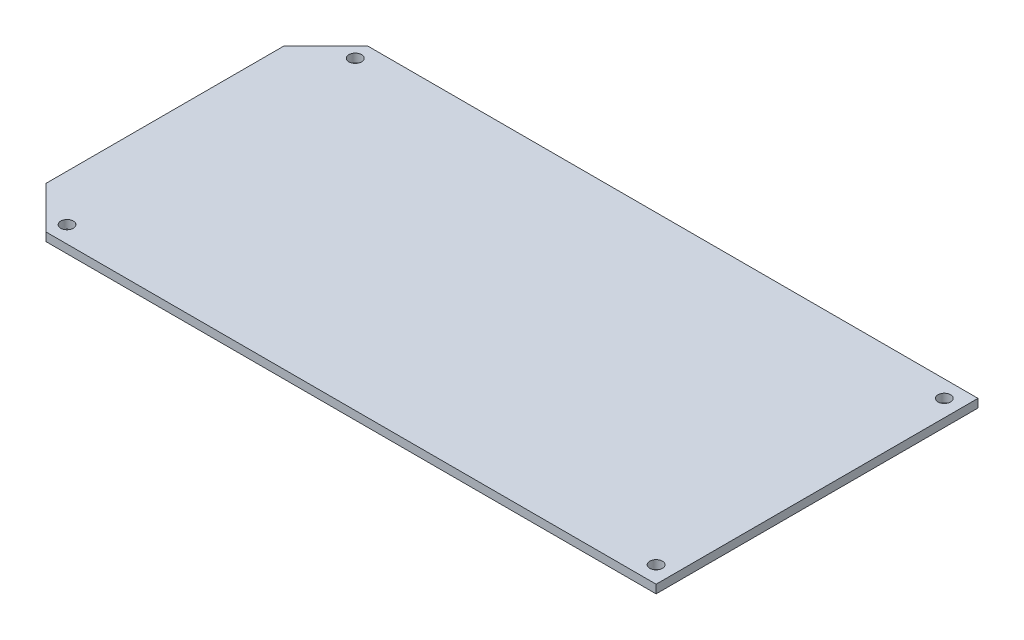
ISO-10303-21;
HEADER;
FILE_DESCRIPTION(('STEP AP214'),'2;1');
FILE_NAME('part.step','',(''),(''),'','','');
FILE_SCHEMA(('AUTOMOTIVE_DESIGN { 1 0 10303 214 1 1 1 1 }'));
ENDSEC;
DATA;
#1=APPLICATION_CONTEXT('core data for automotive mechanical design processes');
#2=APPLICATION_PROTOCOL_DEFINITION('international standard','automotive_design',2000,#1);
#3=PRODUCT_CONTEXT('',#1,'mechanical');
#4=PRODUCT('Part','Part','',(#3));
#5=PRODUCT_RELATED_PRODUCT_CATEGORY('part','',(#4));
#6=PRODUCT_DEFINITION_FORMATION('','',#4);
#7=PRODUCT_DEFINITION_CONTEXT('part definition',#1,'design');
#8=PRODUCT_DEFINITION('design','',#6,#7);
#9=PRODUCT_DEFINITION_SHAPE('','',#8);
#10=(LENGTH_UNIT() NAMED_UNIT(*) SI_UNIT(.MILLI.,.METRE.));
#11=(NAMED_UNIT(*) PLANE_ANGLE_UNIT() SI_UNIT($,.RADIAN.));
#12=(NAMED_UNIT(*) SI_UNIT($,.STERADIAN.) SOLID_ANGLE_UNIT());
#13=UNCERTAINTY_MEASURE_WITH_UNIT(LENGTH_MEASURE(1.E-05),#10,'distance_accuracy_value','');
#14=(GEOMETRIC_REPRESENTATION_CONTEXT(3) GLOBAL_UNCERTAINTY_ASSIGNED_CONTEXT((#13)) GLOBAL_UNIT_ASSIGNED_CONTEXT((#10,
#11,#12)) REPRESENTATION_CONTEXT('',''));
#15=CARTESIAN_POINT('',(0.,0.,0.));
#16=DIRECTION('',(0.,0.,1.));
#17=DIRECTION('',(1.,0.,0.));
#18=AXIS2_PLACEMENT_3D('',#15,#16,#17);
#19=CARTESIAN_POINT('',(77.5,2.,38.25));
#20=DIRECTION('',(-1.,0.,0.));
#21=DIRECTION('',(0.,0.,1.));
#22=AXIS2_PLACEMENT_3D('',#19,#20,#21);
#23=PLANE('',#22);
#24=DIRECTION('',(0.,0.,-1.));
#25=VECTOR('',#24,1.);
#26=CARTESIAN_POINT('',(77.5,0.,38.25));
#27=LINE('',#26,#25);
#28=CARTESIAN_POINT('',(77.5,0.,38.25));
#29=VERTEX_POINT('',#28);
#30=CARTESIAN_POINT('',(77.5,0.,-38.25));
#31=VERTEX_POINT('',#30);
#32=EDGE_CURVE('E109',#29,#31,#27,.T.);
#33=ORIENTED_EDGE('',*,*,#32,.T.);
#34=DIRECTION('',(0.,-1.,0.));
#35=VECTOR('',#34,1.);
#36=CARTESIAN_POINT('',(77.5,2.,-38.25));
#37=LINE('',#36,#35);
#38=CARTESIAN_POINT('',(77.5,2.,-38.25));
#39=VERTEX_POINT('',#38);
#40=EDGE_CURVE('E92',#39,#31,#37,.T.);
#41=ORIENTED_EDGE('',*,*,#40,.F.);
#42=DIRECTION('',(0.,0.,-1.));
#43=VECTOR('',#42,1.);
#44=CARTESIAN_POINT('',(77.5,2.,38.25));
#45=LINE('',#44,#43);
#46=CARTESIAN_POINT('',(77.5,2.,38.25));
#47=VERTEX_POINT('',#46);
#48=EDGE_CURVE('E97',#47,#39,#45,.T.);
#49=ORIENTED_EDGE('',*,*,#48,.F.);
#50=DIRECTION('',(0.,-1.,0.));
#51=VECTOR('',#50,1.);
#52=CARTESIAN_POINT('',(77.5,2.,38.25));
#53=LINE('',#52,#51);
#54=EDGE_CURVE('E111',#47,#29,#53,.T.);
#55=ORIENTED_EDGE('',*,*,#54,.T.);
#56=EDGE_LOOP('',(#33,#41,#49,#55));
#57=FACE_BOUND('',#56,.T.);
#58=ADVANCED_FACE('F35',(#57),#23,.F.);
#59=CARTESIAN_POINT('',(-77.5,2.,-38.25));
#60=DIRECTION('',(0.,0.,1.));
#61=DIRECTION('',(1.,0.,0.));
#62=AXIS2_PLACEMENT_3D('',#59,#60,#61);
#63=PLANE('',#62);
#64=DIRECTION('',(-1.,0.,0.));
#65=VECTOR('',#64,1.);
#66=CARTESIAN_POINT('',(-77.5,0.,-38.25));
#67=LINE('',#66,#65);
#68=CARTESIAN_POINT('',(-67.5,0.,-38.25));
#69=VERTEX_POINT('',#68);
#70=EDGE_CURVE('E141',#31,#69,#67,.T.);
#71=ORIENTED_EDGE('',*,*,#70,.T.);
#72=DIRECTION('',(0.,1.,0.));
#73=VECTOR('',#72,1.);
#74=CARTESIAN_POINT('',(-67.5,2.,-38.25));
#75=LINE('',#74,#73);
#76=CARTESIAN_POINT('',(-67.5,2.,-38.25));
#77=VERTEX_POINT('',#76);
#78=EDGE_CURVE('E11',#69,#77,#75,.T.);
#79=ORIENTED_EDGE('',*,*,#78,.T.);
#80=DIRECTION('',(-1.,0.,0.));
#81=VECTOR('',#80,1.);
#82=CARTESIAN_POINT('',(-77.5,2.,-38.25));
#83=LINE('',#82,#81);
#84=EDGE_CURVE('E88',#39,#77,#83,.T.);
#85=ORIENTED_EDGE('',*,*,#84,.F.);
#86=ORIENTED_EDGE('',*,*,#40,.T.);
#87=EDGE_LOOP('',(#71,#79,#85,#86));
#88=FACE_BOUND('',#87,.T.);
#89=ADVANCED_FACE('F90',(#88),#63,.F.);
#90=CARTESIAN_POINT('',(-77.5,2.,38.25));
#91=DIRECTION('',(1.,0.,0.));
#92=DIRECTION('',(0.,0.,-1.));
#93=AXIS2_PLACEMENT_3D('',#90,#91,#92);
#94=PLANE('',#93);
#95=DIRECTION('',(0.,0.,1.));
#96=VECTOR('',#95,1.);
#97=CARTESIAN_POINT('',(-77.5,0.,38.25));
#98=LINE('',#97,#96);
#99=CARTESIAN_POINT('',(-77.5,0.,-28.25));
#100=VERTEX_POINT('',#99);
#101=CARTESIAN_POINT('',(-77.5,0.,28.25));
#102=VERTEX_POINT('',#101);
#103=EDGE_CURVE('E138',#100,#102,#98,.T.);
#104=ORIENTED_EDGE('',*,*,#103,.T.);
#105=DIRECTION('',(0.,1.,0.));
#106=VECTOR('',#105,1.);
#107=CARTESIAN_POINT('',(-77.5,2.,28.25));
#108=LINE('',#107,#106);
#109=CARTESIAN_POINT('',(-77.5,2.,28.25));
#110=VERTEX_POINT('',#109);
#111=EDGE_CURVE('E57',#102,#110,#108,.T.);
#112=ORIENTED_EDGE('',*,*,#111,.T.);
#113=DIRECTION('',(0.,0.,1.));
#114=VECTOR('',#113,1.);
#115=CARTESIAN_POINT('',(-77.5,2.,38.25));
#116=LINE('',#115,#114);
#117=CARTESIAN_POINT('',(-77.5,2.,-28.25));
#118=VERTEX_POINT('',#117);
#119=EDGE_CURVE('E96',#118,#110,#116,.T.);
#120=ORIENTED_EDGE('',*,*,#119,.F.);
#121=DIRECTION('',(0.,-1.,0.));
#122=VECTOR('',#121,1.);
#123=CARTESIAN_POINT('',(-77.5,2.,-28.25));
#124=LINE('',#123,#122);
#125=EDGE_CURVE('E122',#118,#100,#124,.T.);
#126=ORIENTED_EDGE('',*,*,#125,.T.);
#127=EDGE_LOOP('',(#104,#112,#120,#126));
#128=FACE_BOUND('',#127,.T.);
#129=ADVANCED_FACE('F139',(#128),#94,.F.);
#130=CARTESIAN_POINT('',(-77.5,2.,38.25));
#131=DIRECTION('',(0.,0.,-1.));
#132=DIRECTION('',(-1.,0.,0.));
#133=AXIS2_PLACEMENT_3D('',#130,#131,#132);
#134=PLANE('',#133);
#135=DIRECTION('',(1.,0.,0.));
#136=VECTOR('',#135,1.);
#137=CARTESIAN_POINT('',(-77.5,2.,38.25));
#138=LINE('',#137,#136);
#139=CARTESIAN_POINT('',(-67.5,2.,38.25));
#140=VERTEX_POINT('',#139);
#141=EDGE_CURVE('E102',#140,#47,#138,.T.);
#142=ORIENTED_EDGE('',*,*,#141,.F.);
#143=DIRECTION('',(0.,-1.,0.));
#144=VECTOR('',#143,1.);
#145=CARTESIAN_POINT('',(-67.5,2.,38.25));
#146=LINE('',#145,#144);
#147=CARTESIAN_POINT('',(-67.5,0.,38.25));
#148=VERTEX_POINT('',#147);
#149=EDGE_CURVE('E110',#140,#148,#146,.T.);
#150=ORIENTED_EDGE('',*,*,#149,.T.);
#151=DIRECTION('',(1.,0.,0.));
#152=VECTOR('',#151,1.);
#153=CARTESIAN_POINT('',(-77.5,0.,38.25));
#154=LINE('',#153,#152);
#155=EDGE_CURVE('E106',#148,#29,#154,.T.);
#156=ORIENTED_EDGE('',*,*,#155,.T.);
#157=ORIENTED_EDGE('',*,*,#54,.F.);
#158=EDGE_LOOP('',(#142,#150,#156,#157));
#159=FACE_BOUND('',#158,.T.);
#160=ADVANCED_FACE('F131',(#159),#134,.F.);
#161=CARTESIAN_POINT('',(0.,2.,0.));
#162=DIRECTION('',(0.,-1.,0.));
#163=DIRECTION('',(0.,0.,-1.));
#164=AXIS2_PLACEMENT_3D('',#161,#162,#163);
#165=PLANE('',#164);
#166=CARTESIAN_POINT('',(-66.5,2.,-34.25));
#167=DIRECTION('',(0.,1.,0.));
#168=DIRECTION('',(0.,0.,1.));
#169=AXIS2_PLACEMENT_3D('',#166,#167,#168);
#170=CIRCLE('',#169,1.5);
#171=CARTESIAN_POINT('',(-66.5,2.,-32.75));
#172=VERTEX_POINT('',#171);
#173=EDGE_CURVE('E154',#172,#172,#170,.T.);
#174=ORIENTED_EDGE('',*,*,#173,.F.);
#175=EDGE_LOOP('',(#174));
#176=FACE_BOUND('',#175,.T.);
#177=CARTESIAN_POINT('',(-66.5,2.,34.25));
#178=DIRECTION('',(0.,1.,0.));
#179=DIRECTION('',(0.,0.,1.));
#180=AXIS2_PLACEMENT_3D('',#177,#178,#179);
#181=CIRCLE('',#180,1.5);
#182=CARTESIAN_POINT('',(-66.5,2.,35.75));
#183=VERTEX_POINT('',#182);
#184=EDGE_CURVE('E160',#183,#183,#181,.T.);
#185=ORIENTED_EDGE('',*,*,#184,.F.);
#186=EDGE_LOOP('',(#185));
#187=FACE_BOUND('',#186,.T.);
#188=CARTESIAN_POINT('',(73.5,2.,34.25));
#189=DIRECTION('',(0.,1.,0.));
#190=DIRECTION('',(0.,0.,1.));
#191=AXIS2_PLACEMENT_3D('',#188,#189,#190);
#192=CIRCLE('',#191,1.5);
#193=CARTESIAN_POINT('',(73.5,2.,35.75));
#194=VERTEX_POINT('',#193);
#195=EDGE_CURVE('E166',#194,#194,#192,.T.);
#196=ORIENTED_EDGE('',*,*,#195,.F.);
#197=EDGE_LOOP('',(#196));
#198=FACE_BOUND('',#197,.T.);
#199=CARTESIAN_POINT('',(73.5,2.,-34.25));
#200=DIRECTION('',(0.,1.,0.));
#201=DIRECTION('',(0.,0.,1.));
#202=AXIS2_PLACEMENT_3D('',#199,#200,#201);
#203=CIRCLE('',#202,1.5);
#204=CARTESIAN_POINT('',(73.5,2.,-32.75));
#205=VERTEX_POINT('',#204);
#206=EDGE_CURVE('E148',#205,#205,#203,.T.);
#207=ORIENTED_EDGE('',*,*,#206,.F.);
#208=EDGE_LOOP('',(#207));
#209=FACE_BOUND('',#208,.T.);
#210=ORIENTED_EDGE('',*,*,#119,.T.);
#211=DIRECTION('',(-0.707106781186546,0.,-0.70710678118655));
#212=VECTOR('',#211,1.);
#213=CARTESIAN_POINT('',(-67.5,2.,38.25));
#214=LINE('',#213,#212);
#215=EDGE_CURVE('E44',#110,#140,#214,.F.);
#216=ORIENTED_EDGE('',*,*,#215,.T.);
#217=ORIENTED_EDGE('',*,*,#141,.T.);
#218=ORIENTED_EDGE('',*,*,#48,.T.);
#219=ORIENTED_EDGE('',*,*,#84,.T.);
#220=DIRECTION('',(0.707106781186549,0.,-0.707106781186546));
#221=VECTOR('',#220,1.);
#222=CARTESIAN_POINT('',(-77.5,2.,-28.25));
#223=LINE('',#222,#221);
#224=EDGE_CURVE('E126',#77,#118,#223,.F.);
#225=ORIENTED_EDGE('',*,*,#224,.T.);
#226=EDGE_LOOP('',(#210,#216,#217,#218,#219,#225));
#227=FACE_BOUND('',#226,.T.);
#228=ADVANCED_FACE('F100',(#176,#187,#198,#209,#227),#165,.F.);
#229=CARTESIAN_POINT('',(0.,0.,0.));
#230=DIRECTION('',(0.,-1.,0.));
#231=DIRECTION('',(0.,0.,-1.));
#232=AXIS2_PLACEMENT_3D('',#229,#230,#231);
#233=PLANE('',#232);
#234=CARTESIAN_POINT('',(-66.5,0.,-34.25));
#235=DIRECTION('',(0.,1.,0.));
#236=DIRECTION('',(0.,0.,1.));
#237=AXIS2_PLACEMENT_3D('',#234,#235,#236);
#238=CIRCLE('',#237,1.5);
#239=CARTESIAN_POINT('',(-66.5,0.,-32.75));
#240=VERTEX_POINT('',#239);
#241=EDGE_CURVE('E157',#240,#240,#238,.T.);
#242=ORIENTED_EDGE('',*,*,#241,.T.);
#243=EDGE_LOOP('',(#242));
#244=FACE_BOUND('',#243,.T.);
#245=CARTESIAN_POINT('',(-66.5,0.,34.25));
#246=DIRECTION('',(0.,1.,0.));
#247=DIRECTION('',(0.,0.,1.));
#248=AXIS2_PLACEMENT_3D('',#245,#246,#247);
#249=CIRCLE('',#248,1.5);
#250=CARTESIAN_POINT('',(-66.5,0.,35.75));
#251=VERTEX_POINT('',#250);
#252=EDGE_CURVE('E163',#251,#251,#249,.T.);
#253=ORIENTED_EDGE('',*,*,#252,.T.);
#254=EDGE_LOOP('',(#253));
#255=FACE_BOUND('',#254,.T.);
#256=CARTESIAN_POINT('',(73.5,0.,34.25));
#257=DIRECTION('',(0.,1.,0.));
#258=DIRECTION('',(0.,0.,1.));
#259=AXIS2_PLACEMENT_3D('',#256,#257,#258);
#260=CIRCLE('',#259,1.5);
#261=CARTESIAN_POINT('',(73.5,0.,35.75));
#262=VERTEX_POINT('',#261);
#263=EDGE_CURVE('E151',#262,#262,#260,.T.);
#264=ORIENTED_EDGE('',*,*,#263,.T.);
#265=EDGE_LOOP('',(#264));
#266=FACE_BOUND('',#265,.T.);
#267=CARTESIAN_POINT('',(73.5,0.,-34.25));
#268=DIRECTION('',(0.,1.,0.));
#269=DIRECTION('',(0.,0.,1.));
#270=AXIS2_PLACEMENT_3D('',#267,#268,#269);
#271=CIRCLE('',#270,1.5);
#272=CARTESIAN_POINT('',(73.5,0.,-32.75));
#273=VERTEX_POINT('',#272);
#274=EDGE_CURVE('E145',#273,#273,#271,.T.);
#275=ORIENTED_EDGE('',*,*,#274,.T.);
#276=EDGE_LOOP('',(#275));
#277=FACE_BOUND('',#276,.T.);
#278=ORIENTED_EDGE('',*,*,#155,.F.);
#279=DIRECTION('',(0.707106781186546,0.,0.70710678118655));
#280=VECTOR('',#279,1.);
#281=CARTESIAN_POINT('',(-52.8750000000002,0.,52.8749999999999));
#282=LINE('',#281,#280);
#283=EDGE_CURVE('E120',#148,#102,#282,.F.);
#284=ORIENTED_EDGE('',*,*,#283,.T.);
#285=ORIENTED_EDGE('',*,*,#103,.F.);
#286=DIRECTION('',(-0.707106781186549,0.,0.707106781186546));
#287=VECTOR('',#286,1.);
#288=CARTESIAN_POINT('',(-52.8749999999998,0.,-52.8750000000001));
#289=LINE('',#288,#287);
#290=EDGE_CURVE('E114',#100,#69,#289,.F.);
#291=ORIENTED_EDGE('',*,*,#290,.T.);
#292=ORIENTED_EDGE('',*,*,#70,.F.);
#293=ORIENTED_EDGE('',*,*,#32,.F.);
#294=EDGE_LOOP('',(#278,#284,#285,#291,#292,#293));
#295=FACE_BOUND('',#294,.T.);
#296=ADVANCED_FACE('F137',(#244,#255,#266,#277,#295),#233,.T.);
#297=CARTESIAN_POINT('',(73.5,0.,-34.25));
#298=DIRECTION('',(0.,1.,0.));
#299=DIRECTION('',(0.,0.,1.));
#300=AXIS2_PLACEMENT_3D('',#297,#298,#299);
#301=CYLINDRICAL_SURFACE('',#300,1.5);
#302=ORIENTED_EDGE('',*,*,#274,.F.);
#303=EDGE_LOOP('',(#302));
#304=FACE_BOUND('',#303,.T.);
#305=ORIENTED_EDGE('',*,*,#206,.T.);
#306=EDGE_LOOP('',(#305));
#307=FACE_BOUND('',#306,.T.);
#308=ADVANCED_FACE('F178',(#304,#307),#301,.F.);
#309=CARTESIAN_POINT('',(73.5,0.,34.25));
#310=DIRECTION('',(0.,1.,0.));
#311=DIRECTION('',(0.,0.,1.));
#312=AXIS2_PLACEMENT_3D('',#309,#310,#311);
#313=CYLINDRICAL_SURFACE('',#312,1.5);
#314=ORIENTED_EDGE('',*,*,#263,.F.);
#315=EDGE_LOOP('',(#314));
#316=FACE_BOUND('',#315,.T.);
#317=ORIENTED_EDGE('',*,*,#195,.T.);
#318=EDGE_LOOP('',(#317));
#319=FACE_BOUND('',#318,.T.);
#320=ADVANCED_FACE('F174',(#316,#319),#313,.F.);
#321=CARTESIAN_POINT('',(-66.5,0.,34.25));
#322=DIRECTION('',(0.,1.,0.));
#323=DIRECTION('',(0.,0.,1.));
#324=AXIS2_PLACEMENT_3D('',#321,#322,#323);
#325=CYLINDRICAL_SURFACE('',#324,1.5);
#326=ORIENTED_EDGE('',*,*,#252,.F.);
#327=EDGE_LOOP('',(#326));
#328=FACE_BOUND('',#327,.T.);
#329=ORIENTED_EDGE('',*,*,#184,.T.);
#330=EDGE_LOOP('',(#329));
#331=FACE_BOUND('',#330,.T.);
#332=ADVANCED_FACE('F177',(#328,#331),#325,.F.);
#333=CARTESIAN_POINT('',(-66.5,0.,-34.25));
#334=DIRECTION('',(0.,1.,0.));
#335=DIRECTION('',(0.,0.,1.));
#336=AXIS2_PLACEMENT_3D('',#333,#334,#335);
#337=CYLINDRICAL_SURFACE('',#336,1.5);
#338=ORIENTED_EDGE('',*,*,#241,.F.);
#339=EDGE_LOOP('',(#338));
#340=FACE_BOUND('',#339,.T.);
#341=ORIENTED_EDGE('',*,*,#173,.T.);
#342=EDGE_LOOP('',(#341));
#343=FACE_BOUND('',#342,.T.);
#344=ADVANCED_FACE('F211',(#340,#343),#337,.F.);
#345=CARTESIAN_POINT('',(-67.5,2.,38.25));
#346=DIRECTION('',(0.707106781186549,0.,-0.707106781186545));
#347=DIRECTION('',(0.,-1.,0.));
#348=AXIS2_PLACEMENT_3D('',#345,#346,#347);
#349=PLANE('',#348);
#350=ORIENTED_EDGE('',*,*,#215,.F.);
#351=ORIENTED_EDGE('',*,*,#111,.F.);
#352=ORIENTED_EDGE('',*,*,#283,.F.);
#353=ORIENTED_EDGE('',*,*,#149,.F.);
#354=EDGE_LOOP('',(#350,#351,#352,#353));
#355=FACE_BOUND('',#354,.T.);
#356=ADVANCED_FACE('F134',(#355),#349,.F.);
#357=CARTESIAN_POINT('',(-77.5,2.,-28.25));
#358=DIRECTION('',(0.707106781186546,0.,0.707106781186549));
#359=DIRECTION('',(0.,-1.,0.));
#360=AXIS2_PLACEMENT_3D('',#357,#358,#359);
#361=PLANE('',#360);
#362=ORIENTED_EDGE('',*,*,#224,.F.);
#363=ORIENTED_EDGE('',*,*,#78,.F.);
#364=ORIENTED_EDGE('',*,*,#290,.F.);
#365=ORIENTED_EDGE('',*,*,#125,.F.);
#366=EDGE_LOOP('',(#362,#363,#364,#365));
#367=FACE_BOUND('',#366,.T.);
#368=ADVANCED_FACE('F38',(#367),#361,.F.);
#369=CLOSED_SHELL('',(#58,#89,#129,#160,#228,#296,#308,#320,#332,#344,#356,#368));
#370=MANIFOLD_SOLID_BREP('B2',#369);
#371=ADVANCED_BREP_SHAPE_REPRESENTATION('',(#18,#370),#14);
#372=SHAPE_DEFINITION_REPRESENTATION(#9,#371);
ENDSEC;
END-ISO-10303-21;
